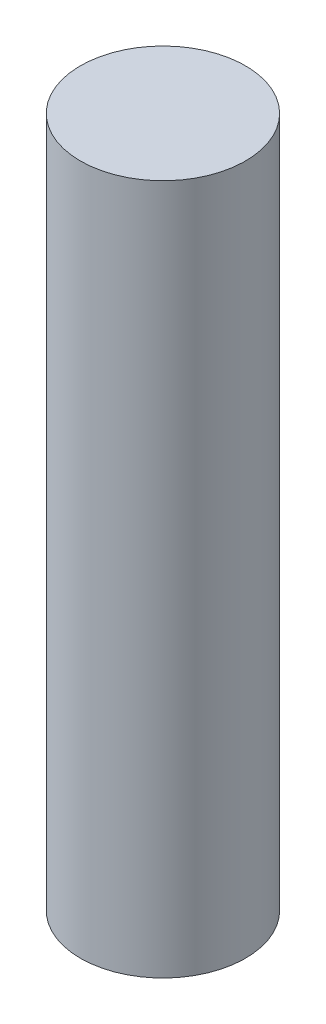
ISO-10303-21;
HEADER;
FILE_DESCRIPTION(('STEP AP214'),'2;1');
FILE_NAME('part.step','',(''),(''),'','','');
FILE_SCHEMA(('AUTOMOTIVE_DESIGN { 1 0 10303 214 1 1 1 1 }'));
ENDSEC;
DATA;
#1=APPLICATION_CONTEXT('core data for automotive mechanical design processes');
#2=APPLICATION_PROTOCOL_DEFINITION('international standard','automotive_design',2000,#1);
#3=PRODUCT_CONTEXT('',#1,'mechanical');
#4=PRODUCT('Part','Part','',(#3));
#5=PRODUCT_RELATED_PRODUCT_CATEGORY('part','',(#4));
#6=PRODUCT_DEFINITION_FORMATION('','',#4);
#7=PRODUCT_DEFINITION_CONTEXT('part definition',#1,'design');
#8=PRODUCT_DEFINITION('design','',#6,#7);
#9=PRODUCT_DEFINITION_SHAPE('','',#8);
#10=(LENGTH_UNIT() NAMED_UNIT(*) SI_UNIT(.MILLI.,.METRE.));
#11=(NAMED_UNIT(*) PLANE_ANGLE_UNIT() SI_UNIT($,.RADIAN.));
#12=(NAMED_UNIT(*) SI_UNIT($,.STERADIAN.) SOLID_ANGLE_UNIT());
#13=UNCERTAINTY_MEASURE_WITH_UNIT(LENGTH_MEASURE(1.E-05),#10,'distance_accuracy_value','');
#14=(GEOMETRIC_REPRESENTATION_CONTEXT(3) GLOBAL_UNCERTAINTY_ASSIGNED_CONTEXT((#13)) GLOBAL_UNIT_ASSIGNED_CONTEXT((#10,
#11,#12)) REPRESENTATION_CONTEXT('',''));
#15=CARTESIAN_POINT('',(0.,0.,0.));
#16=DIRECTION('',(0.,0.,1.));
#17=DIRECTION('',(1.,0.,0.));
#18=AXIS2_PLACEMENT_3D('',#15,#16,#17);
#19=CARTESIAN_POINT('',(0.,251.,0.));
#20=DIRECTION('',(0.,-1.,0.));
#21=DIRECTION('',(0.,0.,-1.));
#22=AXIS2_PLACEMENT_3D('',#19,#20,#21);
#23=CYLINDRICAL_SURFACE('',#22,30.);
#24=CARTESIAN_POINT('',(0.,251.,0.));
#25=DIRECTION('',(0.,1.,0.));
#26=DIRECTION('',(0.,0.,1.));
#27=AXIS2_PLACEMENT_3D('',#24,#25,#26);
#28=CIRCLE('',#27,30.);
#29=CARTESIAN_POINT('',(0.,251.,30.));
#30=VERTEX_POINT('',#29);
#31=EDGE_CURVE('E10',#30,#30,#28,.T.);
#32=ORIENTED_EDGE('',*,*,#31,.F.);
#33=EDGE_LOOP('',(#32));
#34=FACE_BOUND('',#33,.T.);
#35=CARTESIAN_POINT('',(0.,0.,0.));
#36=DIRECTION('',(0.,1.,0.));
#37=DIRECTION('',(0.,0.,1.));
#38=AXIS2_PLACEMENT_3D('',#35,#36,#37);
#39=CIRCLE('',#38,30.);
#40=CARTESIAN_POINT('',(0.,0.,30.));
#41=VERTEX_POINT('',#40);
#42=EDGE_CURVE('E34',#41,#41,#39,.T.);
#43=ORIENTED_EDGE('',*,*,#42,.T.);
#44=EDGE_LOOP('',(#43));
#45=FACE_BOUND('',#44,.T.);
#46=ADVANCED_FACE('F31',(#34,#45),#23,.T.);
#47=CARTESIAN_POINT('',(0.,251.,0.));
#48=DIRECTION('',(0.,1.,0.));
#49=DIRECTION('',(0.,0.,1.));
#50=AXIS2_PLACEMENT_3D('',#47,#48,#49);
#51=PLANE('',#50);
#52=ORIENTED_EDGE('',*,*,#31,.T.);
#53=EDGE_LOOP('',(#52));
#54=FACE_BOUND('',#53,.T.);
#55=ADVANCED_FACE('F46',(#54),#51,.T.);
#56=CARTESIAN_POINT('',(0.,0.,0.));
#57=DIRECTION('',(0.,1.,0.));
#58=DIRECTION('',(0.,0.,1.));
#59=AXIS2_PLACEMENT_3D('',#56,#57,#58);
#60=PLANE('',#59);
#61=ORIENTED_EDGE('',*,*,#42,.F.);
#62=EDGE_LOOP('',(#61));
#63=FACE_BOUND('',#62,.T.);
#64=ADVANCED_FACE('F44',(#63),#60,.F.);
#65=CLOSED_SHELL('',(#46,#55,#64));
#66=MANIFOLD_SOLID_BREP('B2',#65);
#67=ADVANCED_BREP_SHAPE_REPRESENTATION('',(#18,#66),#14);
#68=SHAPE_DEFINITION_REPRESENTATION(#9,#67);
ENDSEC;
END-ISO-10303-21;
